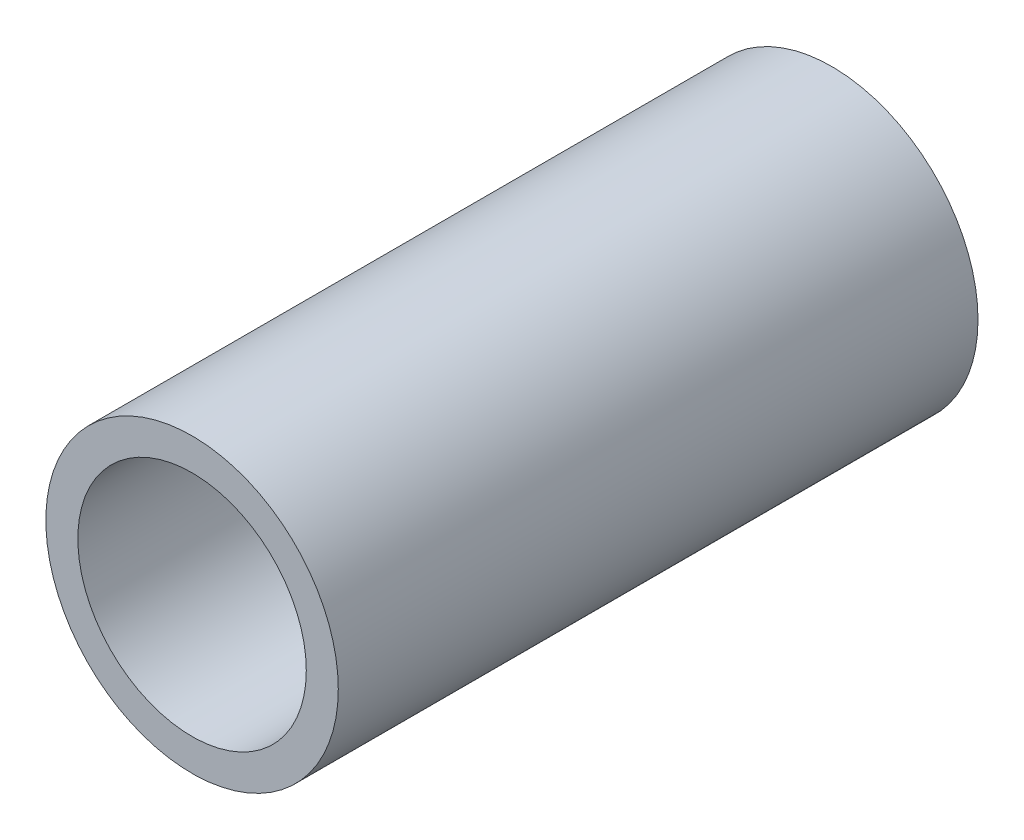
ISO-10303-21;
HEADER;
FILE_DESCRIPTION(('STEP AP214'),'2;1');
FILE_NAME('part.step','',(''),(''),'','','');
FILE_SCHEMA(('AUTOMOTIVE_DESIGN { 1 0 10303 214 1 1 1 1 }'));
ENDSEC;
DATA;
#1=APPLICATION_CONTEXT('core data for automotive mechanical design processes');
#2=APPLICATION_PROTOCOL_DEFINITION('international standard','automotive_design',2000,#1);
#3=PRODUCT_CONTEXT('',#1,'mechanical');
#4=PRODUCT('Part','Part','',(#3));
#5=PRODUCT_RELATED_PRODUCT_CATEGORY('part','',(#4));
#6=PRODUCT_DEFINITION_FORMATION('','',#4);
#7=PRODUCT_DEFINITION_CONTEXT('part definition',#1,'design');
#8=PRODUCT_DEFINITION('design','',#6,#7);
#9=PRODUCT_DEFINITION_SHAPE('','',#8);
#10=(LENGTH_UNIT() NAMED_UNIT(*) SI_UNIT(.MILLI.,.METRE.));
#11=(NAMED_UNIT(*) PLANE_ANGLE_UNIT() SI_UNIT($,.RADIAN.));
#12=(NAMED_UNIT(*) SI_UNIT($,.STERADIAN.) SOLID_ANGLE_UNIT());
#13=UNCERTAINTY_MEASURE_WITH_UNIT(LENGTH_MEASURE(1.E-05),#10,'distance_accuracy_value','');
#14=(GEOMETRIC_REPRESENTATION_CONTEXT(3) GLOBAL_UNCERTAINTY_ASSIGNED_CONTEXT((#13)) GLOBAL_UNIT_ASSIGNED_CONTEXT((#10,
#11,#12)) REPRESENTATION_CONTEXT('',''));
#15=CARTESIAN_POINT('',(0.,0.,0.));
#16=DIRECTION('',(0.,0.,1.));
#17=DIRECTION('',(1.,0.,0.));
#18=AXIS2_PLACEMENT_3D('',#15,#16,#17);
#19=CARTESIAN_POINT('',(0.,0.,70.));
#20=DIRECTION('',(0.,0.,-1.));
#21=DIRECTION('',(-1.,0.,0.));
#22=AXIS2_PLACEMENT_3D('',#19,#20,#21);
#23=CYLINDRICAL_SURFACE('',#22,16.);
#24=CARTESIAN_POINT('',(0.,0.,70.));
#25=DIRECTION('',(0.,0.,1.));
#26=DIRECTION('',(1.,0.,0.));
#27=AXIS2_PLACEMENT_3D('',#24,#25,#26);
#28=CIRCLE('',#27,16.);
#29=CARTESIAN_POINT('',(16.,0.,70.));
#30=VERTEX_POINT('',#29);
#31=EDGE_CURVE('E10',#30,#30,#28,.T.);
#32=ORIENTED_EDGE('',*,*,#31,.F.);
#33=EDGE_LOOP('',(#32));
#34=FACE_BOUND('',#33,.T.);
#35=CARTESIAN_POINT('',(0.,0.,0.));
#36=DIRECTION('',(0.,0.,1.));
#37=DIRECTION('',(1.,0.,0.));
#38=AXIS2_PLACEMENT_3D('',#35,#36,#37);
#39=CIRCLE('',#38,16.);
#40=CARTESIAN_POINT('',(16.,0.,0.));
#41=VERTEX_POINT('',#40);
#42=EDGE_CURVE('E34',#41,#41,#39,.T.);
#43=ORIENTED_EDGE('',*,*,#42,.T.);
#44=EDGE_LOOP('',(#43));
#45=FACE_BOUND('',#44,.T.);
#46=ADVANCED_FACE('F31',(#34,#45),#23,.T.);
#47=CARTESIAN_POINT('',(0.,0.,70.));
#48=DIRECTION('',(0.,0.,1.));
#49=DIRECTION('',(1.,0.,0.));
#50=AXIS2_PLACEMENT_3D('',#47,#48,#49);
#51=PLANE('',#50);
#52=CARTESIAN_POINT('',(0.,0.,70.));
#53=DIRECTION('',(0.,0.,1.));
#54=DIRECTION('',(1.,0.,0.));
#55=AXIS2_PLACEMENT_3D('',#52,#53,#54);
#56=CIRCLE('',#55,12.5);
#57=CARTESIAN_POINT('',(12.5,0.,70.));
#58=VERTEX_POINT('',#57);
#59=EDGE_CURVE('E43',#58,#58,#56,.T.);
#60=ORIENTED_EDGE('',*,*,#59,.F.);
#61=EDGE_LOOP('',(#60));
#62=FACE_BOUND('',#61,.T.);
#63=ORIENTED_EDGE('',*,*,#31,.T.);
#64=EDGE_LOOP('',(#63));
#65=FACE_BOUND('',#64,.T.);
#66=ADVANCED_FACE('F58',(#62,#65),#51,.T.);
#67=CARTESIAN_POINT('',(0.,0.,0.));
#68=DIRECTION('',(0.,0.,1.));
#69=DIRECTION('',(1.,0.,0.));
#70=AXIS2_PLACEMENT_3D('',#67,#68,#69);
#71=PLANE('',#70);
#72=ORIENTED_EDGE('',*,*,#42,.F.);
#73=EDGE_LOOP('',(#72));
#74=FACE_BOUND('',#73,.T.);
#75=ADVANCED_FACE('F54',(#74),#71,.F.);
#76=CARTESIAN_POINT('',(0.,0.,1.));
#77=DIRECTION('',(0.,0.,1.));
#78=DIRECTION('',(1.,0.,0.));
#79=AXIS2_PLACEMENT_3D('',#76,#77,#78);
#80=CYLINDRICAL_SURFACE('',#79,12.5);
#81=CARTESIAN_POINT('',(0.,0.,1.));
#82=DIRECTION('',(0.,0.,1.));
#83=DIRECTION('',(1.,0.,0.));
#84=AXIS2_PLACEMENT_3D('',#81,#82,#83);
#85=CIRCLE('',#84,12.5);
#86=CARTESIAN_POINT('',(12.5,0.,1.));
#87=VERTEX_POINT('',#86);
#88=EDGE_CURVE('E41',#87,#87,#85,.T.);
#89=ORIENTED_EDGE('',*,*,#88,.F.);
#90=EDGE_LOOP('',(#89));
#91=FACE_BOUND('',#90,.T.);
#92=ORIENTED_EDGE('',*,*,#59,.T.);
#93=EDGE_LOOP('',(#92));
#94=FACE_BOUND('',#93,.T.);
#95=ADVANCED_FACE('F51',(#91,#94),#80,.F.);
#96=CARTESIAN_POINT('',(0.,0.,1.));
#97=DIRECTION('',(0.,0.,1.));
#98=DIRECTION('',(1.,0.,0.));
#99=AXIS2_PLACEMENT_3D('',#96,#97,#98);
#100=PLANE('',#99);
#101=ORIENTED_EDGE('',*,*,#88,.T.);
#102=EDGE_LOOP('',(#101));
#103=FACE_BOUND('',#102,.T.);
#104=ADVANCED_FACE('F49',(#103),#100,.T.);
#105=CLOSED_SHELL('',(#46,#66,#75,#95,#104));
#106=MANIFOLD_SOLID_BREP('B2',#105);
#107=ADVANCED_BREP_SHAPE_REPRESENTATION('',(#18,#106),#14);
#108=SHAPE_DEFINITION_REPRESENTATION(#9,#107);
ENDSEC;
END-ISO-10303-21;
